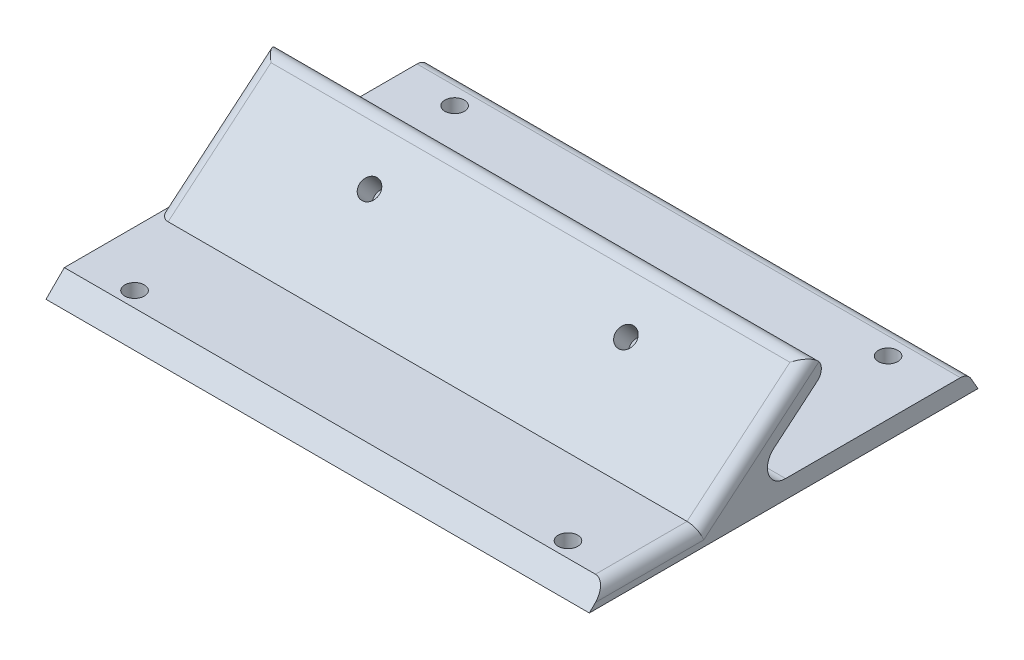
ISO-10303-21;
HEADER;
FILE_DESCRIPTION(('STEP AP214'),'2;1');
FILE_NAME('part.step','',(''),(''),'','','');
FILE_SCHEMA(('AUTOMOTIVE_DESIGN { 1 0 10303 214 1 1 1 1 }'));
ENDSEC;
DATA;
#1=APPLICATION_CONTEXT('core data for automotive mechanical design processes');
#2=APPLICATION_PROTOCOL_DEFINITION('international standard','automotive_design',2000,#1);
#3=PRODUCT_CONTEXT('',#1,'mechanical');
#4=PRODUCT('Part','Part','',(#3));
#5=PRODUCT_RELATED_PRODUCT_CATEGORY('part','',(#4));
#6=PRODUCT_DEFINITION_FORMATION('','',#4);
#7=PRODUCT_DEFINITION_CONTEXT('part definition',#1,'design');
#8=PRODUCT_DEFINITION('design','',#6,#7);
#9=PRODUCT_DEFINITION_SHAPE('','',#8);
#10=(LENGTH_UNIT() NAMED_UNIT(*) SI_UNIT(.MILLI.,.METRE.));
#11=(NAMED_UNIT(*) PLANE_ANGLE_UNIT() SI_UNIT($,.RADIAN.));
#12=(NAMED_UNIT(*) SI_UNIT($,.STERADIAN.) SOLID_ANGLE_UNIT());
#13=UNCERTAINTY_MEASURE_WITH_UNIT(LENGTH_MEASURE(1.E-05),#10,'distance_accuracy_value','');
#14=(GEOMETRIC_REPRESENTATION_CONTEXT(3) GLOBAL_UNCERTAINTY_ASSIGNED_CONTEXT((#13)) GLOBAL_UNIT_ASSIGNED_CONTEXT((#10,
#11,#12)) REPRESENTATION_CONTEXT('',''));
#15=CARTESIAN_POINT('',(0.,0.,0.));
#16=DIRECTION('',(0.,0.,1.));
#17=DIRECTION('',(1.,0.,0.));
#18=AXIS2_PLACEMENT_3D('',#15,#16,#17);
#19=CARTESIAN_POINT('',(0.,1.,-28.9446155554796));
#20=DIRECTION('',(1.,0.,0.));
#21=DIRECTION('',(0.,0.,-1.));
#22=AXIS2_PLACEMENT_3D('',#19,#20,#21);
#23=CYLINDRICAL_SURFACE('',#22,2.);
#24=DIRECTION('',(-1.,0.,0.));
#25=VECTOR('',#24,1.);
#26=CARTESIAN_POINT('',(0.,3.,-28.9446155554796));
#27=LINE('',#26,#25);
#28=CARTESIAN_POINT('',(44.5,3.,-28.9446155554796));
#29=VERTEX_POINT('',#28);
#30=CARTESIAN_POINT('',(-44.5,3.,-28.9446155554796));
#31=VERTEX_POINT('',#30);
#32=EDGE_CURVE('E247',#29,#31,#27,.T.);
#33=ORIENTED_EDGE('',*,*,#32,.F.);
#34=CARTESIAN_POINT('',(44.5,1.,-28.9446155554796));
#35=DIRECTION('',(-1.,0.,0.));
#36=DIRECTION('',(0.,0.,1.));
#37=AXIS2_PLACEMENT_3D('',#34,#35,#36);
#38=CIRCLE('',#37,2.);
#39=CARTESIAN_POINT('',(44.5,1.99911157993986,-30.6771789889014));
#40=VERTEX_POINT('',#39);
#41=EDGE_CURVE('E50',#40,#29,#38,.F.);
#42=ORIENTED_EDGE('',*,*,#41,.F.);
#43=DIRECTION('',(-1.,0.,0.));
#44=VECTOR('',#43,1.);
#45=CARTESIAN_POINT('',(0.,1.99911157993986,-30.6771789889014));
#46=LINE('',#45,#44);
#47=CARTESIAN_POINT('',(-44.5,1.99911157993986,-30.6771789889014));
#48=VERTEX_POINT('',#47);
#49=EDGE_CURVE('E250',#48,#40,#46,.F.);
#50=ORIENTED_EDGE('',*,*,#49,.F.);
#51=CARTESIAN_POINT('',(-44.5,1.,-28.9446155554796));
#52=DIRECTION('',(1.,0.,0.));
#53=DIRECTION('',(0.,0.,-1.));
#54=AXIS2_PLACEMENT_3D('',#51,#52,#53);
#55=CIRCLE('',#54,2.);
#56=EDGE_CURVE('E12',#31,#48,#55,.F.);
#57=ORIENTED_EDGE('',*,*,#56,.F.);
#58=EDGE_LOOP('',(#33,#42,#50,#57));
#59=FACE_BOUND('',#58,.T.);
#60=ADVANCED_FACE('F43',(#59),#23,.T.);
#61=CARTESIAN_POINT('',(42.5,18.247835950285,-7.45548563771091));
#62=DIRECTION('',(0.,-0.64274281885544,0.766082024857497));
#63=DIRECTION('',(0.,-0.766082024857497,-0.64274281885544));
#64=AXIS2_PLACEMENT_3D('',#61,#62,#63);
#65=CYLINDRICAL_SURFACE('',#64,2.);
#66=DIRECTION('',(0.,0.64274281885544,-0.766082024857497));
#67=VECTOR('',#66,1.);
#68=CARTESIAN_POINT('',(42.5,19.78,-6.17000000000003));
#69=LINE('',#68,#67);
#70=CARTESIAN_POINT('',(42.5,3.,13.83));
#71=VERTEX_POINT('',#70);
#72=CARTESIAN_POINT('',(42.5,17.1405385646454,-3.02403881364174));
#73=VERTEX_POINT('',#72);
#74=EDGE_CURVE('E311',#71,#73,#69,.T.);
#75=ORIENTED_EDGE('',*,*,#74,.F.);
#76=CARTESIAN_POINT('',(42.5,0.999999999999999,13.1021257452271));
#77=DIRECTION('',(0.,-0.341992671809282,0.939702619145413));
#78=DIRECTION('',(0.,-0.939702619145413,-0.341992671809282));
#79=AXIS2_PLACEMENT_3D('',#76,#77,#78);
#80=ELLIPSE('',#79,2.12833289942178,2.);
#81=CARTESIAN_POINT('',(44.5,1.,13.1021257452271));
#82=VERTEX_POINT('',#81);
#83=EDGE_CURVE('E243',#71,#82,#80,.F.);
#84=ORIENTED_EDGE('',*,*,#83,.T.);
#85=DIRECTION('',(0.,0.64274281885544,-0.766082024857497));
#86=VECTOR('',#85,1.);
#87=CARTESIAN_POINT('',(44.5,18.247835950285,-7.45548563771091));
#88=LINE('',#87,#86);
#89=CARTESIAN_POINT('',(44.5,16.838058386583,-5.7751786487932));
#90=VERTEX_POINT('',#89);
#91=EDGE_CURVE('E244',#90,#82,#88,.F.);
#92=ORIENTED_EDGE('',*,*,#91,.F.);
#93=CARTESIAN_POINT('',(44.5,16.838058386583,-5.7751786487932));
#94=CARTESIAN_POINT('',(44.5000105960896,16.8723193971268,-5.74894536307866));
#95=CARTESIAN_POINT('',(44.4986066010815,16.9056761117672,-5.72154180141901));
#96=CARTESIAN_POINT('',(44.4930247114185,16.9703190796319,-5.66469478153045));
#97=CARTESIAN_POINT('',(44.4888486596968,17.0016066932603,-5.6352526902077));
#98=CARTESIAN_POINT('',(44.4778222650486,17.0616536463217,-5.57483724683319));
#99=CARTESIAN_POINT('',(44.4709936686558,17.090431272338,-5.54387809123128));
#100=CARTESIAN_POINT('',(44.4547864972777,17.1455736754869,-5.48052332212431));
#101=CARTESIAN_POINT('',(44.4454076414123,17.1719381864165,-5.44812755072258));
#102=CARTESIAN_POINT('',(44.4137171455591,17.2471113528643,-5.34939751647689));
#103=CARTESIAN_POINT('',(44.3878137443419,17.2921973078263,-5.28131939798361));
#104=CARTESIAN_POINT('',(44.3279101213079,17.3721823479652,-5.14273751204747));
#105=CARTESIAN_POINT('',(44.2938930181719,17.4070598519793,-5.07222895304768));
#106=CARTESIAN_POINT('',(44.2048383891613,17.478655219538,-4.9030581337611));
#107=CARTESIAN_POINT('',(44.146763796259,17.5108469504413,-4.80407592547614));
#108=CARTESIAN_POINT('',(44.0215266007927,17.5584192503598,-4.60788192271221));
#109=CARTESIAN_POINT('',(43.9543473783157,17.573768597377,-4.5106737436754));
#110=CARTESIAN_POINT('',(43.7863991473915,17.5928940527212,-4.28300938242154));
#111=CARTESIAN_POINT('',(43.6826657874561,17.5899263346094,-4.15418449409696));
#112=CARTESIAN_POINT('',(43.4676489284914,17.560586598791,-3.90590278529222));
#113=CARTESIAN_POINT('',(43.3563536424813,17.534177231525,-3.78646124600526));
#114=CARTESIAN_POINT('',(43.12312998611,17.4593502415062,-3.5521117862541));
#115=CARTESIAN_POINT('',(43.0009540863011,17.4097948617438,-3.43782119847955));
#116=CARTESIAN_POINT('',(42.7546009609264,17.2912281970808,-3.22281721517273));
#117=CARTESIAN_POINT('',(42.6304287403389,17.222260038153,-3.12207444774028));
#118=CARTESIAN_POINT('',(42.5042618177319,17.1432164092281,-3.02723583096294));
#119=CARTESIAN_POINT('',(42.5021308855405,17.1418787742957,-3.02563621236733));
#120=CARTESIAN_POINT('',(42.5,17.1405385646454,-3.02403881364174));
#121=B_SPLINE_CURVE_WITH_KNOTS('',3,(#93,#94,#95,#96,#97,#98,#99,#100,#101,#102,#103,#104,#105,
#106,#107,#108,#109,#110,#111,#112,#113,#114,#115,#116,#117,#118,#119,#120),.UNSPECIFIED.,.F.,
.F.,(4,2,2,2,2,2,2,2,2,2,2,2,2,4),(0.,0.12939459092906,0.258703243115622,0.386973419483062,
0.5152577289795,0.770984239227395,1.02724752640287,1.38283518290273,1.73908091122075,
2.23267873552265,2.72706442332069,3.24882752941225,3.76944055195139,3.77838482969743),.UNSPECIFIED.);
#122=EDGE_CURVE('E236',#73,#90,#121,.F.);
#123=ORIENTED_EDGE('',*,*,#122,.F.);
#124=EDGE_LOOP('',(#75,#84,#92,#123));
#125=FACE_BOUND('',#124,.T.);
#126=ADVANCED_FACE('F230',(#125),#65,.T.);
#127=CARTESIAN_POINT('',(-42.5,18.247835950285,-7.45548563771091));
#128=DIRECTION('',(0.,0.64274281885544,-0.766082024857497));
#129=DIRECTION('',(0.,0.766082024857497,0.64274281885544));
#130=AXIS2_PLACEMENT_3D('',#127,#128,#129);
#131=CYLINDRICAL_SURFACE('',#130,2.);
#132=DIRECTION('',(0.,-0.64274281885544,0.766082024857497));
#133=VECTOR('',#132,1.);
#134=CARTESIAN_POINT('',(-42.5,19.78,-6.17000000000003));
#135=LINE('',#134,#133);
#136=CARTESIAN_POINT('',(-42.5,17.1405385646454,-3.02403881364174));
#137=VERTEX_POINT('',#136);
#138=CARTESIAN_POINT('',(-42.5,3.,13.83));
#139=VERTEX_POINT('',#138);
#140=EDGE_CURVE('E203',#137,#139,#135,.T.);
#141=ORIENTED_EDGE('',*,*,#140,.F.);
#142=CARTESIAN_POINT('',(-44.5,16.838058386583,-5.7751786487932));
#143=CARTESIAN_POINT('',(-44.5000105960896,16.8723193971268,-5.74894536307866));
#144=CARTESIAN_POINT('',(-44.4986066010815,16.9056761117672,-5.721541801419));
#145=CARTESIAN_POINT('',(-44.4930247114185,16.9703190796319,-5.66469478153045));
#146=CARTESIAN_POINT('',(-44.4888486596967,17.0016066932603,-5.6352526902077));
#147=CARTESIAN_POINT('',(-44.4778222650486,17.0616536463217,-5.57483724683319));
#148=CARTESIAN_POINT('',(-44.4709936686558,17.090431272338,-5.54387809123128));
#149=CARTESIAN_POINT('',(-44.4547864972776,17.1455736754869,-5.48052332212431));
#150=CARTESIAN_POINT('',(-44.4454076414122,17.1719381864165,-5.44812755072259));
#151=CARTESIAN_POINT('',(-44.4137171455591,17.2471113528643,-5.34939751647689));
#152=CARTESIAN_POINT('',(-44.3878137443418,17.2921973078263,-5.28131939798361));
#153=CARTESIAN_POINT('',(-44.3279101213079,17.3721823479652,-5.14273751204747));
#154=CARTESIAN_POINT('',(-44.2938930181719,17.4070598519793,-5.07222895304768));
#155=CARTESIAN_POINT('',(-44.2048383891612,17.478655219538,-4.9030581337611));
#156=CARTESIAN_POINT('',(-44.146763796259,17.5108469504413,-4.80407592547614));
#157=CARTESIAN_POINT('',(-44.0215266007927,17.5584192503598,-4.60788192271221));
#158=CARTESIAN_POINT('',(-43.9543473783157,17.573768597377,-4.5106737436754));
#159=CARTESIAN_POINT('',(-43.7863991473915,17.5928940527212,-4.28300938242154));
#160=CARTESIAN_POINT('',(-43.6826657874561,17.5899263346094,-4.15418449409695));
#161=CARTESIAN_POINT('',(-43.4676489284914,17.560586598791,-3.90590278529224));
#162=CARTESIAN_POINT('',(-43.3563536424813,17.534177231525,-3.78646124600531));
#163=CARTESIAN_POINT('',(-43.12312998611,17.4593502415062,-3.55211178625405));
#164=CARTESIAN_POINT('',(-43.0009540863013,17.4097948617437,-3.43782119847936));
#165=CARTESIAN_POINT('',(-42.7546009609261,17.291228197081,-3.22281721517292));
#166=CARTESIAN_POINT('',(-42.630428740338,17.2222600381536,-3.12207444774099));
#167=CARTESIAN_POINT('',(-42.5042618177318,17.1432164092281,-3.02723583096297));
#168=CARTESIAN_POINT('',(-42.5021308855404,17.1418787742957,-3.02563621236735));
#169=CARTESIAN_POINT('',(-42.5,17.1405385646454,-3.02403881364174));
#170=B_SPLINE_CURVE_WITH_KNOTS('',3,(#142,#143,#144,#145,#146,#147,#148,#149,#150,#151,#152,
#153,#154,#155,#156,#157,#158,#159,#160,#161,#162,#163,#164,#165,#166,#167,#168,#169),
.UNSPECIFIED.,.F.,.F.,(4,2,2,2,2,2,2,2,2,2,2,2,2,4),(0.,0.12939459092906,0.258703243115619,
0.386973419483055,0.515257728979496,0.770984239227392,1.02724752640286,1.38283518290273,
1.73908091122075,2.23267873552264,2.72706442332068,3.24882752941225,3.76944055195138,
3.77838482969743),.UNSPECIFIED.);
#171=CARTESIAN_POINT('',(-44.5,16.838058386583,-5.7751786487932));
#172=VERTEX_POINT('',#171);
#173=EDGE_CURVE('E209',#172,#137,#170,.T.);
#174=ORIENTED_EDGE('',*,*,#173,.F.);
#175=DIRECTION('',(0.,-0.64274281885544,0.766082024857497));
#176=VECTOR('',#175,1.);
#177=CARTESIAN_POINT('',(-44.5,18.247835950285,-7.45548563771091));
#178=LINE('',#177,#176);
#179=CARTESIAN_POINT('',(-44.5,3.,10.7183355187671));
#180=VERTEX_POINT('',#179);
#181=EDGE_CURVE('E206',#180,#172,#178,.F.);
#182=ORIENTED_EDGE('',*,*,#181,.F.);
#183=CARTESIAN_POINT('',(-42.5,3.,10.7183355187671));
#184=DIRECTION('',(0.,1.,0.));
#185=DIRECTION('',(0.,0.,-1.));
#186=AXIS2_PLACEMENT_3D('',#183,#184,#185);
#187=ELLIPSE('',#186,3.11166448123292,2.);
#188=EDGE_CURVE('E218',#180,#139,#187,.T.);
#189=ORIENTED_EDGE('',*,*,#188,.T.);
#190=EDGE_LOOP('',(#141,#174,#182,#189));
#191=FACE_BOUND('',#190,.T.);
#192=ADVANCED_FACE('F225',(#191),#131,.T.);
#193=CARTESIAN_POINT('',(42.5,1.,0.));
#194=DIRECTION('',(0.,0.,1.));
#195=DIRECTION('',(1.,0.,0.));
#196=AXIS2_PLACEMENT_3D('',#193,#194,#195);
#197=CYLINDRICAL_SURFACE('',#196,2.);
#198=DIRECTION('',(0.,0.,-1.));
#199=VECTOR('',#198,1.);
#200=CARTESIAN_POINT('',(42.5,3.,0.));
#201=LINE('',#200,#199);
#202=CARTESIAN_POINT('',(42.5,3.,28.83));
#203=VERTEX_POINT('',#202);
#204=EDGE_CURVE('E189',#203,#71,#201,.T.);
#205=ORIENTED_EDGE('',*,*,#204,.F.);
#206=CARTESIAN_POINT('',(42.5,1.,30.83));
#207=DIRECTION('',(0.,0.707106781186552,0.707106781186543));
#208=DIRECTION('',(0.,-0.707106781186543,0.707106781186552));
#209=AXIS2_PLACEMENT_3D('',#206,#207,#208);
#210=ELLIPSE('',#209,2.82842712474621,2.);
#211=CARTESIAN_POINT('',(44.5,1.,30.83));
#212=VERTEX_POINT('',#211);
#213=EDGE_CURVE('E201',#212,#203,#210,.T.);
#214=ORIENTED_EDGE('',*,*,#213,.F.);
#215=DIRECTION('',(0.,0.,-1.));
#216=VECTOR('',#215,1.);
#217=CARTESIAN_POINT('',(44.5,1.,0.));
#218=LINE('',#217,#216);
#219=EDGE_CURVE('E151',#82,#212,#218,.F.);
#220=ORIENTED_EDGE('',*,*,#219,.F.);
#221=ORIENTED_EDGE('',*,*,#83,.F.);
#222=EDGE_LOOP('',(#205,#214,#220,#221));
#223=FACE_BOUND('',#222,.T.);
#224=ADVANCED_FACE('F229',(#223),#197,.T.);
#225=CARTESIAN_POINT('',(44.5,5.97915891753685,-0.315335571586608));
#226=DIRECTION('',(1.,0.,0.));
#227=DIRECTION('',(0.,0.,-1.));
#228=AXIS2_PLACEMENT_3D('',#225,#226,#227);
#229=CYLINDRICAL_SURFACE('',#228,2.97915891753685);
#230=DIRECTION('',(-1.,0.,0.));
#231=VECTOR('',#230,1.);
#232=CARTESIAN_POINT('',(44.5,8.2613890107022,1.59955702534667));
#233=LINE('',#232,#231);
#234=CARTESIAN_POINT('',(44.5,8.2613890107022,1.59955702534667));
#235=VERTEX_POINT('',#234);
#236=CARTESIAN_POINT('',(-44.5,8.2613890107022,1.59955702534667));
#237=VERTEX_POINT('',#236);
#238=EDGE_CURVE('E179',#235,#237,#233,.T.);
#239=ORIENTED_EDGE('',*,*,#238,.F.);
#240=CARTESIAN_POINT('',(44.5,5.97915891753685,-0.315335571586608));
#241=DIRECTION('',(-1.,0.,0.));
#242=DIRECTION('',(0.,0.,1.));
#243=AXIS2_PLACEMENT_3D('',#240,#241,#242);
#244=CIRCLE('',#243,2.97915891753685);
#245=CARTESIAN_POINT('',(44.5,3.,-0.315335571586611));
#246=VERTEX_POINT('',#245);
#247=EDGE_CURVE('E185',#235,#246,#244,.F.);
#248=ORIENTED_EDGE('',*,*,#247,.T.);
#249=DIRECTION('',(-1.,0.,0.));
#250=VECTOR('',#249,1.);
#251=CARTESIAN_POINT('',(44.5,3.,-0.315335571586608));
#252=LINE('',#251,#250);
#253=CARTESIAN_POINT('',(-44.5,3.,-0.315335571586611));
#254=VERTEX_POINT('',#253);
#255=EDGE_CURVE('E182',#254,#246,#252,.F.);
#256=ORIENTED_EDGE('',*,*,#255,.F.);
#257=CARTESIAN_POINT('',(-44.5,5.97915891753685,-0.315335571586608));
#258=DIRECTION('',(1.,0.,0.));
#259=DIRECTION('',(0.,0.,-1.));
#260=AXIS2_PLACEMENT_3D('',#257,#258,#259);
#261=CIRCLE('',#260,2.97915891753685);
#262=EDGE_CURVE('E187',#254,#237,#261,.F.);
#263=ORIENTED_EDGE('',*,*,#262,.T.);
#264=EDGE_LOOP('',(#239,#248,#256,#263));
#265=FACE_BOUND('',#264,.T.);
#266=ADVANCED_FACE('F359',(#265),#229,.F.);
#267=CARTESIAN_POINT('',(44.5,15.6734408010115,-4.25493383733057));
#268=DIRECTION('',(1.,0.,0.));
#269=DIRECTION('',(0.,0.,-1.));
#270=AXIS2_PLACEMENT_3D('',#267,#268,#269);
#271=CYLINDRICAL_SURFACE('',#270,1.91506616266945);
#272=DIRECTION('',(1.,0.,0.));
#273=VECTOR('',#272,1.);
#274=CARTESIAN_POINT('',(-44.5,17.1405385646454,-3.02403881364174));
#275=LINE('',#274,#273);
#276=EDGE_CURVE('E169',#73,#137,#275,.F.);
#277=ORIENTED_EDGE('',*,*,#276,.F.);
#278=ORIENTED_EDGE('',*,*,#122,.T.);
#279=CARTESIAN_POINT('',(44.5,15.6734408010115,-4.25493383733057));
#280=DIRECTION('',(-1.,0.,0.));
#281=DIRECTION('',(0.,0.,1.));
#282=AXIS2_PLACEMENT_3D('',#279,#280,#281);
#283=CIRCLE('',#282,1.91506616266945);
#284=CARTESIAN_POINT('',(44.5,14.2063751802018,-5.48586717087866));
#285=VERTEX_POINT('',#284);
#286=EDGE_CURVE('E174',#285,#90,#283,.F.);
#287=ORIENTED_EDGE('',*,*,#286,.F.);
#288=DIRECTION('',(1.,0.,0.));
#289=VECTOR('',#288,1.);
#290=CARTESIAN_POINT('',(-44.5,14.2063751802018,-5.48586717087866));
#291=LINE('',#290,#289);
#292=CARTESIAN_POINT('',(-44.5,14.2063751802018,-5.48586717087866));
#293=VERTEX_POINT('',#292);
#294=EDGE_CURVE('E171',#293,#285,#291,.T.);
#295=ORIENTED_EDGE('',*,*,#294,.F.);
#296=CARTESIAN_POINT('',(-44.5,15.6734408010115,-4.25493383733057));
#297=DIRECTION('',(1.,0.,0.));
#298=DIRECTION('',(0.,0.,-1.));
#299=AXIS2_PLACEMENT_3D('',#296,#297,#298);
#300=CIRCLE('',#299,1.91506616266945);
#301=EDGE_CURVE('E177',#172,#293,#300,.F.);
#302=ORIENTED_EDGE('',*,*,#301,.F.);
#303=ORIENTED_EDGE('',*,*,#173,.T.);
#304=EDGE_LOOP('',(#277,#278,#287,#295,#302,#303));
#305=FACE_BOUND('',#304,.T.);
#306=ADVANCED_FACE('F221',(#305),#271,.T.);
#307=CARTESIAN_POINT('',(0.,3.,0.));
#308=DIRECTION('',(0.,1.,0.));
#309=DIRECTION('',(0.,0.,1.));
#310=AXIS2_PLACEMENT_3D('',#307,#308,#309);
#311=PLANE('',#310);
#312=CARTESIAN_POINT('',(35.5,3.,-26.1));
#313=DIRECTION('',(0.,1.,0.));
#314=DIRECTION('',(0.,0.,1.));
#315=AXIS2_PLACEMENT_3D('',#312,#313,#314);
#316=CIRCLE('',#315,1.6);
#317=CARTESIAN_POINT('',(35.5,3.,-24.5));
#318=VERTEX_POINT('',#317);
#319=EDGE_CURVE('E269',#318,#318,#316,.T.);
#320=ORIENTED_EDGE('',*,*,#319,.F.);
#321=EDGE_LOOP('',(#320));
#322=FACE_BOUND('',#321,.T.);
#323=CARTESIAN_POINT('',(-35.5,3.,-26.1));
#324=DIRECTION('',(0.,1.,0.));
#325=DIRECTION('',(0.,0.,1.));
#326=AXIS2_PLACEMENT_3D('',#323,#324,#325);
#327=CIRCLE('',#326,1.6);
#328=CARTESIAN_POINT('',(-35.5,3.,-24.5));
#329=VERTEX_POINT('',#328);
#330=EDGE_CURVE('E281',#329,#329,#327,.T.);
#331=ORIENTED_EDGE('',*,*,#330,.F.);
#332=EDGE_LOOP('',(#331));
#333=FACE_BOUND('',#332,.T.);
#334=DIRECTION('',(0.,0.,-1.));
#335=VECTOR('',#334,1.);
#336=CARTESIAN_POINT('',(44.5,3.,-31.83));
#337=LINE('',#336,#335);
#338=EDGE_CURVE('E141',#246,#29,#337,.T.);
#339=ORIENTED_EDGE('',*,*,#338,.T.);
#340=ORIENTED_EDGE('',*,*,#32,.T.);
#341=DIRECTION('',(0.,0.,1.));
#342=VECTOR('',#341,1.);
#343=CARTESIAN_POINT('',(-44.5,3.,-31.83));
#344=LINE('',#343,#342);
#345=EDGE_CURVE('E163',#31,#254,#344,.T.);
#346=ORIENTED_EDGE('',*,*,#345,.T.);
#347=ORIENTED_EDGE('',*,*,#255,.T.);
#348=EDGE_LOOP('',(#339,#340,#346,#347));
#349=FACE_BOUND('',#348,.T.);
#350=ADVANCED_FACE('F254',(#322,#333,#349),#311,.T.);
#351=CARTESIAN_POINT('',(44.5,3.,-31.83));
#352=DIRECTION('',(-1.,0.,0.));
#353=DIRECTION('',(0.,0.,1.));
#354=AXIS2_PLACEMENT_3D('',#351,#352,#353);
#355=PLANE('',#354);
#356=DIRECTION('',(0.,0.866281716710863,0.49955578996993));
#357=VECTOR('',#356,1.);
#358=CARTESIAN_POINT('',(44.5,2.25133203812256,-30.531731858016));
#359=LINE('',#358,#357);
#360=CARTESIAN_POINT('',(44.5,0.,-31.83));
#361=VERTEX_POINT('',#360);
#362=EDGE_CURVE('E158',#361,#40,#359,.T.);
#363=ORIENTED_EDGE('',*,*,#362,.T.);
#364=ORIENTED_EDGE('',*,*,#41,.T.);
#365=ORIENTED_EDGE('',*,*,#338,.F.);
#366=ORIENTED_EDGE('',*,*,#247,.F.);
#367=DIRECTION('',(0.,0.642762823312727,-0.766065240672785));
#368=VECTOR('',#367,1.);
#369=CARTESIAN_POINT('',(44.5,7.36842221274772,2.66382334595025));
#370=LINE('',#369,#368);
#371=EDGE_CURVE('E197',#235,#285,#370,.T.);
#372=ORIENTED_EDGE('',*,*,#371,.T.);
#373=ORIENTED_EDGE('',*,*,#286,.T.);
#374=ORIENTED_EDGE('',*,*,#91,.T.);
#375=ORIENTED_EDGE('',*,*,#219,.T.);
#376=DIRECTION('',(0.,0.707106781186543,-0.707106781186552));
#377=VECTOR('',#376,1.);
#378=CARTESIAN_POINT('',(44.5,15.915,15.9149999999998));
#379=LINE('',#378,#377);
#380=CARTESIAN_POINT('',(44.5,0.,31.83));
#381=VERTEX_POINT('',#380);
#382=EDGE_CURVE('E134',#381,#212,#379,.T.);
#383=ORIENTED_EDGE('',*,*,#382,.F.);
#384=DIRECTION('',(0.,0.,-1.));
#385=VECTOR('',#384,1.);
#386=CARTESIAN_POINT('',(44.5,0.,-31.83));
#387=LINE('',#386,#385);
#388=EDGE_CURVE('E149',#381,#361,#387,.T.);
#389=ORIENTED_EDGE('',*,*,#388,.T.);
#390=EDGE_LOOP('',(#363,#364,#365,#366,#372,#373,#374,#375,#383,#389));
#391=FACE_BOUND('',#390,.T.);
#392=ADVANCED_FACE('F148',(#391),#355,.F.);
#393=CARTESIAN_POINT('',(-44.5,3.,-31.83));
#394=DIRECTION('',(1.,0.,0.));
#395=DIRECTION('',(0.,0.,-1.));
#396=AXIS2_PLACEMENT_3D('',#393,#394,#395);
#397=PLANE('',#396);
#398=ORIENTED_EDGE('',*,*,#345,.F.);
#399=ORIENTED_EDGE('',*,*,#56,.T.);
#400=DIRECTION('',(0.,-0.866281716710863,-0.49955578996993));
#401=VECTOR('',#400,1.);
#402=CARTESIAN_POINT('',(-44.5,2.25133203812256,-30.531731858016));
#403=LINE('',#402,#401);
#404=CARTESIAN_POINT('',(-44.5,0.,-31.83));
#405=VERTEX_POINT('',#404);
#406=EDGE_CURVE('E167',#48,#405,#403,.T.);
#407=ORIENTED_EDGE('',*,*,#406,.T.);
#408=DIRECTION('',(0.,0.,1.));
#409=VECTOR('',#408,1.);
#410=CARTESIAN_POINT('',(-44.5,0.,-31.83));
#411=LINE('',#410,#409);
#412=CARTESIAN_POINT('',(-44.5,0.,31.83));
#413=VERTEX_POINT('',#412);
#414=EDGE_CURVE('E142',#405,#413,#411,.T.);
#415=ORIENTED_EDGE('',*,*,#414,.T.);
#416=DIRECTION('',(0.,0.707106781186543,-0.707106781186552));
#417=VECTOR('',#416,1.);
#418=CARTESIAN_POINT('',(-44.5,15.915,15.9149999999998));
#419=LINE('',#418,#417);
#420=CARTESIAN_POINT('',(-44.5,3.,28.83));
#421=VERTEX_POINT('',#420);
#422=EDGE_CURVE('E136',#413,#421,#419,.T.);
#423=ORIENTED_EDGE('',*,*,#422,.T.);
#424=EDGE_CURVE('E256',#180,#421,#344,.T.);
#425=ORIENTED_EDGE('',*,*,#424,.F.);
#426=ORIENTED_EDGE('',*,*,#181,.T.);
#427=ORIENTED_EDGE('',*,*,#301,.T.);
#428=DIRECTION('',(0.,0.642762823312727,-0.766065240672785));
#429=VECTOR('',#428,1.);
#430=CARTESIAN_POINT('',(-44.5,7.36842221274772,2.66382334595025));
#431=LINE('',#430,#429);
#432=EDGE_CURVE('E288',#237,#293,#431,.T.);
#433=ORIENTED_EDGE('',*,*,#432,.F.);
#434=ORIENTED_EDGE('',*,*,#262,.F.);
#435=EDGE_LOOP('',(#398,#399,#407,#415,#423,#425,#426,#427,#433,#434));
#436=FACE_BOUND('',#435,.T.);
#437=ADVANCED_FACE('F323',(#436),#397,.F.);
#438=DIRECTION('',(-1.,0.,0.));
#439=VECTOR('',#438,1.);
#440=CARTESIAN_POINT('',(44.5,3.,28.83));
#441=LINE('',#440,#439);
#442=EDGE_CURVE('E152',#203,#421,#441,.T.);
#443=ORIENTED_EDGE('',*,*,#442,.F.);
#444=ORIENTED_EDGE('',*,*,#204,.T.);
#445=DIRECTION('',(1.,0.,0.));
#446=VECTOR('',#445,1.);
#447=CARTESIAN_POINT('',(-44.5,3.,13.83));
#448=LINE('',#447,#446);
#449=EDGE_CURVE('E278',#139,#71,#448,.T.);
#450=ORIENTED_EDGE('',*,*,#449,.F.);
#451=ORIENTED_EDGE('',*,*,#188,.F.);
#452=ORIENTED_EDGE('',*,*,#424,.T.);
#453=EDGE_LOOP('',(#443,#444,#450,#451,#452));
#454=FACE_BOUND('',#453,.T.);
#455=CARTESIAN_POINT('',(-35.5,3.,26.33));
#456=DIRECTION('',(0.,1.,0.));
#457=DIRECTION('',(0.,0.,1.));
#458=AXIS2_PLACEMENT_3D('',#455,#456,#457);
#459=CIRCLE('',#458,1.6);
#460=CARTESIAN_POINT('',(-35.5,3.,27.93));
#461=VERTEX_POINT('',#460);
#462=EDGE_CURVE('E277',#461,#461,#459,.T.);
#463=ORIENTED_EDGE('',*,*,#462,.F.);
#464=EDGE_LOOP('',(#463));
#465=FACE_BOUND('',#464,.T.);
#466=CARTESIAN_POINT('',(35.5,3.,26.33));
#467=DIRECTION('',(0.,1.,0.));
#468=DIRECTION('',(0.,0.,1.));
#469=AXIS2_PLACEMENT_3D('',#466,#467,#468);
#470=CIRCLE('',#469,1.6);
#471=CARTESIAN_POINT('',(35.5,3.,27.93));
#472=VERTEX_POINT('',#471);
#473=EDGE_CURVE('E265',#472,#472,#470,.T.);
#474=ORIENTED_EDGE('',*,*,#473,.F.);
#475=EDGE_LOOP('',(#474));
#476=FACE_BOUND('',#475,.T.);
#477=ADVANCED_FACE('F318',(#454,#465,#476),#311,.T.);
#478=CARTESIAN_POINT('',(0.,0.,0.));
#479=DIRECTION('',(0.,1.,0.));
#480=DIRECTION('',(0.,0.,1.));
#481=AXIS2_PLACEMENT_3D('',#478,#479,#480);
#482=PLANE('',#481);
#483=CARTESIAN_POINT('',(-35.5,0.,-26.1));
#484=DIRECTION('',(0.,1.,0.));
#485=DIRECTION('',(0.,0.,1.));
#486=AXIS2_PLACEMENT_3D('',#483,#484,#485);
#487=CIRCLE('',#486,1.6);
#488=CARTESIAN_POINT('',(-35.5,0.,-24.5));
#489=VERTEX_POINT('',#488);
#490=EDGE_CURVE('E266',#489,#489,#487,.T.);
#491=ORIENTED_EDGE('',*,*,#490,.T.);
#492=EDGE_LOOP('',(#491));
#493=FACE_BOUND('',#492,.T.);
#494=CARTESIAN_POINT('',(-35.5,0.,26.33));
#495=DIRECTION('',(0.,1.,0.));
#496=DIRECTION('',(0.,0.,1.));
#497=AXIS2_PLACEMENT_3D('',#494,#495,#496);
#498=CIRCLE('',#497,1.6);
#499=CARTESIAN_POINT('',(-35.5,0.,27.93));
#500=VERTEX_POINT('',#499);
#501=EDGE_CURVE('E274',#500,#500,#498,.T.);
#502=ORIENTED_EDGE('',*,*,#501,.T.);
#503=EDGE_LOOP('',(#502));
#504=FACE_BOUND('',#503,.T.);
#505=CARTESIAN_POINT('',(35.5,0.,-26.1));
#506=DIRECTION('',(0.,1.,0.));
#507=DIRECTION('',(0.,0.,1.));
#508=AXIS2_PLACEMENT_3D('',#505,#506,#507);
#509=CIRCLE('',#508,1.6);
#510=CARTESIAN_POINT('',(35.5,0.,-24.5));
#511=VERTEX_POINT('',#510);
#512=EDGE_CURVE('E260',#511,#511,#509,.T.);
#513=ORIENTED_EDGE('',*,*,#512,.T.);
#514=EDGE_LOOP('',(#513));
#515=FACE_BOUND('',#514,.T.);
#516=CARTESIAN_POINT('',(35.5,0.,26.33));
#517=DIRECTION('',(0.,1.,0.));
#518=DIRECTION('',(0.,0.,1.));
#519=AXIS2_PLACEMENT_3D('',#516,#517,#518);
#520=CIRCLE('',#519,1.6);
#521=CARTESIAN_POINT('',(35.5,0.,27.93));
#522=VERTEX_POINT('',#521);
#523=EDGE_CURVE('E262',#522,#522,#520,.T.);
#524=ORIENTED_EDGE('',*,*,#523,.T.);
#525=EDGE_LOOP('',(#524));
#526=FACE_BOUND('',#525,.T.);
#527=ORIENTED_EDGE('',*,*,#388,.F.);
#528=DIRECTION('',(1.,0.,0.));
#529=VECTOR('',#528,1.);
#530=CARTESIAN_POINT('',(-44.5,0.,31.83));
#531=LINE('',#530,#529);
#532=EDGE_CURVE('E131',#413,#381,#531,.T.);
#533=ORIENTED_EDGE('',*,*,#532,.F.);
#534=ORIENTED_EDGE('',*,*,#414,.F.);
#535=DIRECTION('',(-1.,0.,0.));
#536=VECTOR('',#535,1.);
#537=CARTESIAN_POINT('',(-44.5,0.,-31.83));
#538=LINE('',#537,#536);
#539=EDGE_CURVE('E157',#361,#405,#538,.T.);
#540=ORIENTED_EDGE('',*,*,#539,.F.);
#541=EDGE_LOOP('',(#527,#533,#534,#540));
#542=FACE_BOUND('',#541,.T.);
#543=ADVANCED_FACE('F155',(#493,#504,#515,#526,#542),#482,.F.);
#544=CARTESIAN_POINT('',(-292.581303527373,3.,-30.1));
#545=DIRECTION('',(0.,-0.49955578996993,0.866281716710863));
#546=DIRECTION('',(0.,-0.866281716710863,-0.49955578996993));
#547=AXIS2_PLACEMENT_3D('',#544,#545,#546);
#548=PLANE('',#547);
#549=ORIENTED_EDGE('',*,*,#406,.F.);
#550=ORIENTED_EDGE('',*,*,#49,.T.);
#551=ORIENTED_EDGE('',*,*,#362,.F.);
#552=ORIENTED_EDGE('',*,*,#539,.T.);
#553=EDGE_LOOP('',(#549,#550,#551,#552));
#554=FACE_BOUND('',#553,.T.);
#555=ADVANCED_FACE('F326',(#554),#548,.F.);
#556=CARTESIAN_POINT('',(44.5,15.915,15.9149999999998));
#557=DIRECTION('',(0.,0.707106781186552,0.707106781186543));
#558=DIRECTION('',(0.,-0.707106781186543,0.707106781186552));
#559=AXIS2_PLACEMENT_3D('',#556,#557,#558);
#560=PLANE('',#559);
#561=ORIENTED_EDGE('',*,*,#382,.T.);
#562=ORIENTED_EDGE('',*,*,#213,.T.);
#563=ORIENTED_EDGE('',*,*,#442,.T.);
#564=ORIENTED_EDGE('',*,*,#422,.F.);
#565=ORIENTED_EDGE('',*,*,#532,.T.);
#566=EDGE_LOOP('',(#561,#562,#563,#564,#565));
#567=FACE_BOUND('',#566,.T.);
#568=ADVANCED_FACE('F133',(#567),#560,.T.);
#569=CARTESIAN_POINT('',(35.5,0.,26.33));
#570=DIRECTION('',(0.,1.,0.));
#571=DIRECTION('',(0.,0.,1.));
#572=AXIS2_PLACEMENT_3D('',#569,#570,#571);
#573=CYLINDRICAL_SURFACE('',#572,1.6);
#574=ORIENTED_EDGE('',*,*,#523,.F.);
#575=EDGE_LOOP('',(#574));
#576=FACE_BOUND('',#575,.T.);
#577=ORIENTED_EDGE('',*,*,#473,.T.);
#578=EDGE_LOOP('',(#577));
#579=FACE_BOUND('',#578,.T.);
#580=ADVANCED_FACE('F333',(#576,#579),#573,.F.);
#581=CARTESIAN_POINT('',(35.5,0.,-26.1));
#582=DIRECTION('',(0.,1.,0.));
#583=DIRECTION('',(0.,0.,1.));
#584=AXIS2_PLACEMENT_3D('',#581,#582,#583);
#585=CYLINDRICAL_SURFACE('',#584,1.6);
#586=ORIENTED_EDGE('',*,*,#512,.F.);
#587=EDGE_LOOP('',(#586));
#588=FACE_BOUND('',#587,.T.);
#589=ORIENTED_EDGE('',*,*,#319,.T.);
#590=EDGE_LOOP('',(#589));
#591=FACE_BOUND('',#590,.T.);
#592=ADVANCED_FACE('F404',(#588,#591),#585,.F.);
#593=CARTESIAN_POINT('',(-35.5,0.,26.33));
#594=DIRECTION('',(0.,1.,0.));
#595=DIRECTION('',(0.,0.,1.));
#596=AXIS2_PLACEMENT_3D('',#593,#594,#595);
#597=CYLINDRICAL_SURFACE('',#596,1.6);
#598=ORIENTED_EDGE('',*,*,#501,.F.);
#599=EDGE_LOOP('',(#598));
#600=FACE_BOUND('',#599,.T.);
#601=ORIENTED_EDGE('',*,*,#462,.T.);
#602=EDGE_LOOP('',(#601));
#603=FACE_BOUND('',#602,.T.);
#604=ADVANCED_FACE('F409',(#600,#603),#597,.F.);
#605=CARTESIAN_POINT('',(-35.5,0.,-26.1));
#606=DIRECTION('',(0.,1.,0.));
#607=DIRECTION('',(0.,0.,1.));
#608=AXIS2_PLACEMENT_3D('',#605,#606,#607);
#609=CYLINDRICAL_SURFACE('',#608,1.6);
#610=ORIENTED_EDGE('',*,*,#490,.F.);
#611=EDGE_LOOP('',(#610));
#612=FACE_BOUND('',#611,.T.);
#613=ORIENTED_EDGE('',*,*,#330,.T.);
#614=EDGE_LOOP('',(#613));
#615=FACE_BOUND('',#614,.T.);
#616=ADVANCED_FACE('F304',(#612,#615),#609,.F.);
#617=CARTESIAN_POINT('',(-44.5,19.78,-6.17000000000003));
#618=DIRECTION('',(0.,0.766082024857497,0.64274281885544));
#619=DIRECTION('',(0.,-0.64274281885544,0.766082024857497));
#620=AXIS2_PLACEMENT_3D('',#617,#618,#619);
#621=PLANE('',#620);
#622=CARTESIAN_POINT('',(21.,12.6411422828316,2.33876962713752));
#623=DIRECTION('',(0.,0.766082024857497,0.64274281885544));
#624=DIRECTION('',(0.,-0.64274281885544,0.766082024857497));
#625=AXIS2_PLACEMENT_3D('',#622,#623,#624);
#626=CIRCLE('',#625,1.6);
#627=CARTESIAN_POINT('',(21.,11.6127537726629,3.56450086690951));
#628=VERTEX_POINT('',#627);
#629=EDGE_CURVE('E194',#628,#628,#626,.T.);
#630=ORIENTED_EDGE('',*,*,#629,.F.);
#631=EDGE_LOOP('',(#630));
#632=FACE_BOUND('',#631,.T.);
#633=CARTESIAN_POINT('',(-21.,12.6411422828316,2.33876962713752));
#634=DIRECTION('',(0.,0.766082024857497,0.64274281885544));
#635=DIRECTION('',(0.,-0.64274281885544,0.766082024857497));
#636=AXIS2_PLACEMENT_3D('',#633,#634,#635);
#637=CIRCLE('',#636,1.6);
#638=CARTESIAN_POINT('',(-21.,11.6127537726629,3.56450086690951));
#639=VERTEX_POINT('',#638);
#640=EDGE_CURVE('E292',#639,#639,#637,.T.);
#641=ORIENTED_EDGE('',*,*,#640,.F.);
#642=EDGE_LOOP('',(#641));
#643=FACE_BOUND('',#642,.T.);
#644=ORIENTED_EDGE('',*,*,#449,.T.);
#645=ORIENTED_EDGE('',*,*,#74,.T.);
#646=ORIENTED_EDGE('',*,*,#276,.T.);
#647=ORIENTED_EDGE('',*,*,#140,.T.);
#648=EDGE_LOOP('',(#644,#645,#646,#647));
#649=FACE_BOUND('',#648,.T.);
#650=ADVANCED_FACE('F300',(#632,#643,#649),#621,.T.);
#651=CARTESIAN_POINT('',(-44.5,7.36842221274772,2.66382334595025));
#652=DIRECTION('',(0.,-0.766065240672785,-0.642762823312727));
#653=DIRECTION('',(0.,0.642762823312727,-0.766065240672785));
#654=AXIS2_PLACEMENT_3D('',#651,#652,#653);
#655=PLANE('',#654);
#656=CARTESIAN_POINT('',(21.,9.70680671621119,-0.123137913257011));
#657=DIRECTION('',(0.,-0.766065240672785,-0.642762823312727));
#658=DIRECTION('',(0.,0.642762823312727,-0.766065240672785));
#659=AXIS2_PLACEMENT_3D('',#656,#657,#658);
#660=ELLIPSE('',#659,1.60000000054551,1.6);
#661=CARTESIAN_POINT('',(21.,10.7352272338622,-1.34884229875136));
#662=VERTEX_POINT('',#661);
#663=EDGE_CURVE('E193',#662,#662,#660,.T.);
#664=ORIENTED_EDGE('',*,*,#663,.F.);
#665=EDGE_LOOP('',(#664));
#666=FACE_BOUND('',#665,.T.);
#667=CARTESIAN_POINT('',(-21.,9.70680671621119,-0.123137913257011));
#668=DIRECTION('',(0.,-0.766065240672785,-0.642762823312727));
#669=DIRECTION('',(0.,0.642762823312727,-0.766065240672785));
#670=AXIS2_PLACEMENT_3D('',#667,#668,#669);
#671=ELLIPSE('',#670,1.60000000054551,1.6);
#672=CARTESIAN_POINT('',(-21.,10.7352272338622,-1.34884229875136));
#673=VERTEX_POINT('',#672);
#674=EDGE_CURVE('E190',#673,#673,#671,.T.);
#675=ORIENTED_EDGE('',*,*,#674,.F.);
#676=EDGE_LOOP('',(#675));
#677=FACE_BOUND('',#676,.T.);
#678=ORIENTED_EDGE('',*,*,#371,.F.);
#679=ORIENTED_EDGE('',*,*,#238,.T.);
#680=ORIENTED_EDGE('',*,*,#432,.T.);
#681=ORIENTED_EDGE('',*,*,#294,.T.);
#682=EDGE_LOOP('',(#678,#679,#680,#681));
#683=FACE_BOUND('',#682,.T.);
#684=ADVANCED_FACE('F303',(#666,#677,#683),#655,.T.);
#685=CARTESIAN_POINT('',(-21.,4.98032203425663,-4.08865856141688));
#686=DIRECTION('',(0.,0.766082024857497,0.64274281885544));
#687=DIRECTION('',(0.,-0.64274281885544,0.766082024857497));
#688=AXIS2_PLACEMENT_3D('',#685,#686,#687);
#689=CYLINDRICAL_SURFACE('',#688,1.6);
#690=ORIENTED_EDGE('',*,*,#674,.T.);
#691=EDGE_LOOP('',(#690));
#692=FACE_BOUND('',#691,.T.);
#693=ORIENTED_EDGE('',*,*,#640,.T.);
#694=EDGE_LOOP('',(#693));
#695=FACE_BOUND('',#694,.T.);
#696=ADVANCED_FACE('F432',(#692,#695),#689,.F.);
#697=CARTESIAN_POINT('',(21.,4.98032203425663,-4.08865856141688));
#698=DIRECTION('',(0.,0.766082024857497,0.64274281885544));
#699=DIRECTION('',(0.,-0.64274281885544,0.766082024857497));
#700=AXIS2_PLACEMENT_3D('',#697,#698,#699);
#701=CYLINDRICAL_SURFACE('',#700,1.6);
#702=ORIENTED_EDGE('',*,*,#663,.T.);
#703=EDGE_LOOP('',(#702));
#704=FACE_BOUND('',#703,.T.);
#705=ORIENTED_EDGE('',*,*,#629,.T.);
#706=EDGE_LOOP('',(#705));
#707=FACE_BOUND('',#706,.T.);
#708=ADVANCED_FACE('F298',(#704,#707),#701,.F.);
#709=CLOSED_SHELL('',(#60,#126,#192,#224,#266,#306,#350,#392,#437,#477,#543,#555,#568,#580,#592,
#604,#616,#650,#684,#696,#708));
#710=MANIFOLD_SOLID_BREP('B2',#709);
#711=ADVANCED_BREP_SHAPE_REPRESENTATION('',(#18,#710),#14);
#712=SHAPE_DEFINITION_REPRESENTATION(#9,#711);
ENDSEC;
END-ISO-10303-21;
